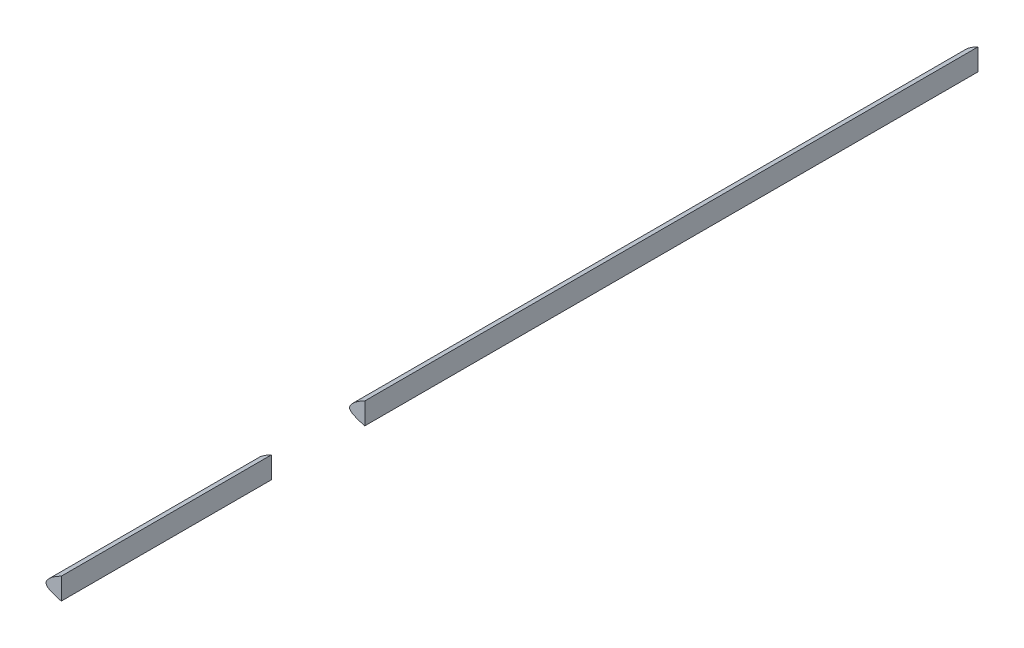
ISO-10303-21;
HEADER;
FILE_DESCRIPTION(('STEP AP214'),'2;1');
FILE_NAME('part.step','',(''),(''),'','','');
FILE_SCHEMA(('AUTOMOTIVE_DESIGN { 1 0 10303 214 1 1 1 1 }'));
ENDSEC;
DATA;
#1=APPLICATION_CONTEXT('core data for automotive mechanical design processes');
#2=APPLICATION_PROTOCOL_DEFINITION('international standard','automotive_design',2000,#1);
#3=PRODUCT_CONTEXT('',#1,'mechanical');
#4=PRODUCT('Part','Part','',(#3));
#5=PRODUCT_RELATED_PRODUCT_CATEGORY('part','',(#4));
#6=PRODUCT_DEFINITION_FORMATION('','',#4);
#7=PRODUCT_DEFINITION_CONTEXT('part definition',#1,'design');
#8=PRODUCT_DEFINITION('design','',#6,#7);
#9=PRODUCT_DEFINITION_SHAPE('','',#8);
#10=(LENGTH_UNIT() NAMED_UNIT(*) SI_UNIT(.MILLI.,.METRE.));
#11=(NAMED_UNIT(*) PLANE_ANGLE_UNIT() SI_UNIT($,.RADIAN.));
#12=(NAMED_UNIT(*) SI_UNIT($,.STERADIAN.) SOLID_ANGLE_UNIT());
#13=UNCERTAINTY_MEASURE_WITH_UNIT(LENGTH_MEASURE(1.E-05),#10,'distance_accuracy_value','');
#14=(GEOMETRIC_REPRESENTATION_CONTEXT(3) GLOBAL_UNCERTAINTY_ASSIGNED_CONTEXT((#13)) GLOBAL_UNIT_ASSIGNED_CONTEXT((#10,
#11,#12)) REPRESENTATION_CONTEXT('',''));
#15=CARTESIAN_POINT('',(0.,0.,0.));
#16=DIRECTION('',(0.,0.,1.));
#17=DIRECTION('',(1.,0.,0.));
#18=AXIS2_PLACEMENT_3D('',#15,#16,#17);
#19=CARTESIAN_POINT('',(1.15165455923713,2.60088125935629,761.999746));
#20=DIRECTION('',(0.,0.,1.));
#21=DIRECTION('',(-1.,0.,0.));
#22=AXIS2_PLACEMENT_3D('',#19,#20,#21);
#23=PLANE('',#22);
#24=DIRECTION('',(0.,-1.,0.));
#25=VECTOR('',#24,1.);
#26=CARTESIAN_POINT('',(12.7000000000001,0.,761.999746));
#27=LINE('',#26,#25);
#28=CARTESIAN_POINT('',(12.7000000000001,11.1170877286177,761.999746));
#29=VERTEX_POINT('',#28);
#30=CARTESIAN_POINT('',(12.7000000000001,-6.87603561469755,761.999746));
#31=VERTEX_POINT('',#30);
#32=EDGE_CURVE('E75',#29,#31,#27,.T.);
#33=ORIENTED_EDGE('',*,*,#32,.F.);
#34=CARTESIAN_POINT('',(324.9026935512,0.,761.999746));
#35=CARTESIAN_POINT('',(324.90346319559,0.0233133583806574,761.999746));
#36=CARTESIAN_POINT('',(322.493960124611,0.266874853266928,761.999746));
#37=CARTESIAN_POINT('',(320.107118726271,0.728898481684864,761.999746));
#38=CARTESIAN_POINT('',(314.479929879271,1.69659954466814,761.999746));
#39=CARTESIAN_POINT('',(307.761979309178,2.96651084650256,761.999746));
#40=CARTESIAN_POINT('',(299.156213965818,4.44402058990994,761.999746));
#41=CARTESIAN_POINT('',(289.108994082194,6.05458721176259,761.999746));
#42=CARTESIAN_POINT('',(277.614504556848,7.85862541822672,761.999746));
#43=CARTESIAN_POINT('',(264.867967681756,9.82863928319501,761.999746));
#44=CARTESIAN_POINT('',(251.037893607433,11.9464568649147,761.999746));
#45=CARTESIAN_POINT('',(236.320520328163,14.1628286822193,761.999746));
#46=CARTESIAN_POINT('',(220.915494029042,16.4347978422618,761.999746));
#47=CARTESIAN_POINT('',(205.033677241231,18.7162921045369,761.999746));
#48=CARTESIAN_POINT('',(188.883341886899,20.9229885970704,761.999746));
#49=CARTESIAN_POINT('',(172.682407247215,22.9973105242966,761.999746));
#50=CARTESIAN_POINT('',(156.622614564687,24.8301784866328,761.999746));
#51=CARTESIAN_POINT('',(140.85040765116,26.2625796247527,761.999746));
#52=CARTESIAN_POINT('',(125.478771127742,27.2050458448488,761.999746));
#53=CARTESIAN_POINT('',(110.596641231566,27.6094132257854,761.999746));
#54=CARTESIAN_POINT('',(96.2853033385808,27.4446531652477,761.999746));
#55=CARTESIAN_POINT('',(82.6164523566715,26.7221772489685,761.999746));
#56=CARTESIAN_POINT('',(69.6684349637199,25.4642524848224,761.999746));
#57=CARTESIAN_POINT('',(57.5288522663284,23.7890753252532,761.999746));
#58=CARTESIAN_POINT('',(46.3056688527853,21.7557737945352,761.999746));
#59=CARTESIAN_POINT('',(36.1124988210342,19.421560606896,761.999746));
#60=CARTESIAN_POINT('',(27.0454876777921,16.8469786053261,761.999746));
#61=CARTESIAN_POINT('',(19.1969550247217,14.0824194665185,761.999746));
#62=CARTESIAN_POINT('',(12.6195182535387,11.1953401492948,761.999746));
#63=CARTESIAN_POINT('',(7.39382924872228,8.27357700541017,761.999746));
#64=CARTESIAN_POINT('',(3.46645559888262,5.36260960395899,761.999746));
#65=CARTESIAN_POINT('',(1.0721441800177,2.69745028336921,761.999746));
#66=CARTESIAN_POINT('',(-0.44301831227786,-0.0163803086251834,761.999746));
#67=CARTESIAN_POINT('',(1.14212328936869,-2.66038157127671,761.999746));
#68=CARTESIAN_POINT('',(4.36503605971503,-4.22676457114381,761.999746));
#69=CARTESIAN_POINT('',(8.97122140423381,-6.02880941856467,761.999746));
#70=CARTESIAN_POINT('',(15.243598773671,-7.49562746974023,761.999746));
#71=CARTESIAN_POINT('',(23.0320560801708,-8.81343307785173,761.999746));
#72=CARTESIAN_POINT('',(32.3248291039904,-9.88501521121111,761.999746));
#73=CARTESIAN_POINT('',(43.02561085123,-10.7220049250572,761.999746));
#74=CARTESIAN_POINT('',(55.0370190293927,-11.3213307402037,761.999746));
#75=CARTESIAN_POINT('',(68.2344021608391,-11.6831205739109,761.999746));
#76=CARTESIAN_POINT('',(82.4768909373014,-11.8216946355356,761.999746));
#77=CARTESIAN_POINT('',(97.6058535702517,-11.7312635564645,761.999746));
#78=CARTESIAN_POINT('',(113.468681032216,-11.4146303668036,761.999746));
#79=CARTESIAN_POINT('',(129.930020512529,-10.7984705199419,761.999746));
#80=CARTESIAN_POINT('',(146.859715046732,-9.93880113727659,761.999746));
#81=CARTESIAN_POINT('',(164.102555427845,-8.95468862894909,761.999746));
#82=CARTESIAN_POINT('',(181.455347717627,-7.91418790276717,761.999746));
#83=CARTESIAN_POINT('',(198.694582838916,-6.86098310953203,761.999746));
#84=CARTESIAN_POINT('',(215.596359860735,-5.83696040869958,761.999746));
#85=CARTESIAN_POINT('',(231.942646986744,-4.86345762457903,761.999746));
#86=CARTESIAN_POINT('',(247.517899408465,-3.96716262112094,761.999746));
#87=CARTESIAN_POINT('',(262.118380872368,-3.15712058268027,761.999746));
#88=CARTESIAN_POINT('',(275.542852028211,-2.44567542809517,761.999746));
#89=CARTESIAN_POINT('',(287.622696903447,-1.83567813821833,761.999746));
#90=CARTESIAN_POINT('',(298.158964312839,-1.30681197821665,761.999746));
#91=CARTESIAN_POINT('',(307.165416690346,-0.826816663963498,761.999746));
#92=CARTESIAN_POINT('',(314.173983408068,-0.368946974828929,761.999746));
#93=CARTESIAN_POINT('',(319.999788969716,-0.117218531002151,761.999746));
#94=CARTESIAN_POINT('',(322.456899939764,0.0391125120748008,761.999746));
#95=CARTESIAN_POINT('',(324.901921434116,-0.0233882589368036,761.999746));
#96=CARTESIAN_POINT('',(324.9026935512,0.,761.999746));
#97=B_SPLINE_CURVE_WITH_KNOTS('',3,(#34,#35,#36,#37,#38,#39,#40,#41,#42,#43,#44,#45,#46,#47,#48,
#49,#50,#51,#52,#53,#54,#55,#56,#57,#58,#59,#60,#61,#62,#63,#64,#65,#66,#67,#68,#69,#70,#71,#72,
#73,#74,#75,#76,#77,#78,#79,#80,#81,#82,#83,#84,#85,#86,#87,#88,#89,#90,#91,#92,#93,#94,#95,
#96),.UNSPECIFIED.,.T.,.F.,(4,1,1,1,1,1,1,1,1,1,1,1,1,1,1,1,1,1,1,1,1,1,1,1,1,1,1,1,1,1,1,1,1,1,
1,1,1,1,1,1,1,1,1,1,1,1,1,1,1,1,1,1,1,1,1,1,1,1,1,1,4),(0.,0.00174808161666409,
0.00682736461152588,0.0148802194660928,0.0255723245187996,0.0386941569613535,0.0541707804092893,
0.0718340915004338,0.0914345327939838,0.112684613523076,0.135293128889252,0.158943981406575,
0.183314993013972,0.208069947428828,0.232879415911381,0.257398767385958,0.28138363259568,
0.304705763006072,0.32724149700788,0.348896563368039,0.369606939586334,0.389308375744097,
0.407885695760754,0.425177148613117,0.441026789913431,0.455299971521906,0.467903884546168,
0.478751648141021,0.487814349118281,0.495090030563699,0.500616983015744,0.504451368015862,
0.507803776366331,0.513091193317012,0.52054622904494,0.530249123140569,0.542213645081559,
0.556382479077403,0.572655501749116,0.590894528635496,0.610925387189739,0.632535858974259,
0.655496365431996,0.679547083246405,0.704498568619219,0.730211424578536,0.756435524546716,
0.782836661122501,0.809062449565475,0.834775916464845,0.859641281327499,0.883337826525987,
0.905540839068826,0.925965138816007,0.944326312756837,0.960365876879218,0.973929437555459,
0.984907697461011,0.993111340436855,0.998246302191831,1.),.UNSPECIFIED.);
#98=EDGE_CURVE('E12',#29,#31,#97,.T.);
#99=ORIENTED_EDGE('',*,*,#98,.T.);
#100=EDGE_LOOP('',(#33,#99));
#101=FACE_BOUND('',#100,.T.);
#102=ADVANCED_FACE('F45',(#101),#23,.T.);
#103=CARTESIAN_POINT('',(12.7000000000001,0.,761.999746));
#104=DIRECTION('',(-1.,0.,0.));
#105=DIRECTION('',(0.,-1.,0.));
#106=AXIS2_PLACEMENT_3D('',#103,#104,#105);
#107=PLANE('',#106);
#108=DIRECTION('',(0.,0.,-1.));
#109=VECTOR('',#108,1.);
#110=CARTESIAN_POINT('',(12.7000000000001,11.1170877286177,761.999746));
#111=LINE('',#110,#109);
#112=CARTESIAN_POINT('',(12.7000000000001,11.1170877286177,587.445357999995));
#113=VERTEX_POINT('',#112);
#114=EDGE_CURVE('E80',#29,#113,#111,.T.);
#115=ORIENTED_EDGE('',*,*,#114,.F.);
#116=ORIENTED_EDGE('',*,*,#32,.T.);
#117=DIRECTION('',(0.,0.,-1.));
#118=VECTOR('',#117,1.);
#119=CARTESIAN_POINT('',(12.7000000000001,-6.87603561469755,761.999746));
#120=LINE('',#119,#118);
#121=CARTESIAN_POINT('',(12.7000000000001,-6.87603561469755,587.445357999995));
#122=VERTEX_POINT('',#121);
#123=EDGE_CURVE('E55',#31,#122,#120,.T.);
#124=ORIENTED_EDGE('',*,*,#123,.T.);
#125=DIRECTION('',(0.,1.,0.));
#126=VECTOR('',#125,1.);
#127=CARTESIAN_POINT('',(12.7000000000001,11.1170877286177,587.445357999995));
#128=LINE('',#127,#126);
#129=EDGE_CURVE('E74',#122,#113,#128,.T.);
#130=ORIENTED_EDGE('',*,*,#129,.T.);
#131=EDGE_LOOP('',(#115,#116,#124,#130));
#132=FACE_BOUND('',#131,.T.);
#133=ADVANCED_FACE('F78',(#132),#107,.F.);
#134=CARTESIAN_POINT('',(324.9026935512,0.,1090.34141295382));
#135=CARTESIAN_POINT('',(324.90346319559,0.0233133583806574,1090.34141295382));
#136=CARTESIAN_POINT('',(322.493960124611,0.266874853266928,1090.34141295382));
#137=CARTESIAN_POINT('',(320.107118726271,0.728898481684864,1090.34141295382));
#138=CARTESIAN_POINT('',(314.479929879271,1.69659954466814,1090.34141295382));
#139=CARTESIAN_POINT('',(307.761979309178,2.96651084650256,1090.34141295382));
#140=CARTESIAN_POINT('',(299.156213965818,4.44402058990994,1090.34141295382));
#141=CARTESIAN_POINT('',(289.108994082194,6.05458721176259,1090.34141295382));
#142=CARTESIAN_POINT('',(277.614504556848,7.85862541822672,1090.34141295382));
#143=CARTESIAN_POINT('',(264.867967681756,9.82863928319501,1090.34141295382));
#144=CARTESIAN_POINT('',(251.037893607433,11.9464568649147,1090.34141295382));
#145=CARTESIAN_POINT('',(236.320520328163,14.1628286822193,1090.34141295382));
#146=CARTESIAN_POINT('',(220.915494029042,16.4347978422618,1090.34141295382));
#147=CARTESIAN_POINT('',(205.033677241231,18.7162921045369,1090.34141295382));
#148=CARTESIAN_POINT('',(188.883341886899,20.9229885970704,1090.34141295382));
#149=CARTESIAN_POINT('',(172.682407247215,22.9973105242966,1090.34141295382));
#150=CARTESIAN_POINT('',(156.622614564687,24.8301784866328,1090.34141295382));
#151=CARTESIAN_POINT('',(140.85040765116,26.2625796247527,1090.34141295382));
#152=CARTESIAN_POINT('',(125.478771127742,27.2050458448488,1090.34141295382));
#153=CARTESIAN_POINT('',(110.596641231566,27.6094132257854,1090.34141295382));
#154=CARTESIAN_POINT('',(96.2853033385808,27.4446531652477,1090.34141295382));
#155=CARTESIAN_POINT('',(82.6164523566715,26.7221772489685,1090.34141295382));
#156=CARTESIAN_POINT('',(69.6684349637199,25.4642524848224,1090.34141295382));
#157=CARTESIAN_POINT('',(57.5288522663284,23.7890753252532,1090.34141295382));
#158=CARTESIAN_POINT('',(46.3056688527853,21.7557737945352,1090.34141295382));
#159=CARTESIAN_POINT('',(36.1124988210342,19.421560606896,1090.34141295382));
#160=CARTESIAN_POINT('',(27.0454876777921,16.8469786053261,1090.34141295382));
#161=CARTESIAN_POINT('',(19.1969550247217,14.0824194665185,1090.34141295382));
#162=CARTESIAN_POINT('',(12.6195182535387,11.1953401492948,1090.34141295382));
#163=CARTESIAN_POINT('',(7.39382924872228,8.27357700541017,1090.34141295382));
#164=CARTESIAN_POINT('',(3.46645559888262,5.36260960395899,1090.34141295382));
#165=CARTESIAN_POINT('',(1.0721441800177,2.69745028336921,1090.34141295382));
#166=CARTESIAN_POINT('',(-0.44301831227786,-0.0163803086251834,1090.34141295382));
#167=CARTESIAN_POINT('',(1.14212328936869,-2.66038157127671,1090.34141295382));
#168=CARTESIAN_POINT('',(4.36503605971503,-4.22676457114381,1090.34141295382));
#169=CARTESIAN_POINT('',(8.97122140423381,-6.02880941856467,1090.34141295382));
#170=CARTESIAN_POINT('',(15.243598773671,-7.49562746974023,1090.34141295382));
#171=CARTESIAN_POINT('',(23.0320560801708,-8.81343307785173,1090.34141295382));
#172=CARTESIAN_POINT('',(32.3248291039904,-9.88501521121111,1090.34141295382));
#173=CARTESIAN_POINT('',(43.02561085123,-10.7220049250572,1090.34141295382));
#174=CARTESIAN_POINT('',(55.0370190293927,-11.3213307402037,1090.34141295382));
#175=CARTESIAN_POINT('',(68.2344021608391,-11.6831205739109,1090.34141295382));
#176=CARTESIAN_POINT('',(82.4768909373014,-11.8216946355356,1090.34141295382));
#177=CARTESIAN_POINT('',(97.6058535702517,-11.7312635564645,1090.34141295382));
#178=CARTESIAN_POINT('',(113.468681032216,-11.4146303668036,1090.34141295382));
#179=CARTESIAN_POINT('',(129.930020512529,-10.7984705199419,1090.34141295382));
#180=CARTESIAN_POINT('',(146.859715046732,-9.93880113727659,1090.34141295382));
#181=CARTESIAN_POINT('',(164.102555427845,-8.95468862894909,1090.34141295382));
#182=CARTESIAN_POINT('',(181.455347717627,-7.91418790276717,1090.34141295382));
#183=CARTESIAN_POINT('',(198.694582838916,-6.86098310953203,1090.34141295382));
#184=CARTESIAN_POINT('',(215.596359860735,-5.83696040869958,1090.34141295382));
#185=CARTESIAN_POINT('',(231.942646986744,-4.86345762457903,1090.34141295382));
#186=CARTESIAN_POINT('',(247.517899408465,-3.96716262112094,1090.34141295382));
#187=CARTESIAN_POINT('',(262.118380872368,-3.15712058268027,1090.34141295382));
#188=CARTESIAN_POINT('',(275.542852028211,-2.44567542809517,1090.34141295382));
#189=CARTESIAN_POINT('',(287.622696903447,-1.83567813821833,1090.34141295382));
#190=CARTESIAN_POINT('',(298.158964312839,-1.30681197821665,1090.34141295382));
#191=CARTESIAN_POINT('',(307.165416690346,-0.826816663963498,1090.34141295382));
#192=CARTESIAN_POINT('',(314.173983408068,-0.368946974828929,1090.34141295382));
#193=CARTESIAN_POINT('',(319.999788969716,-0.117218531002151,1090.34141295382));
#194=CARTESIAN_POINT('',(322.456899939764,0.0391125120748008,1090.34141295382));
#195=CARTESIAN_POINT('',(324.901921434116,-0.0233882589368036,1090.34141295382));
#196=CARTESIAN_POINT('',(324.9026935512,0.,1090.34141295382));
#197=B_SPLINE_CURVE_WITH_KNOTS('',3,(#134,#135,#136,#137,#138,#139,#140,#141,#142,#143,#144,
#145,#146,#147,#148,#149,#150,#151,#152,#153,#154,#155,#156,#157,#158,#159,#160,#161,#162,#163,
#164,#165,#166,#167,#168,#169,#170,#171,#172,#173,#174,#175,#176,#177,#178,#179,#180,#181,#182,
#183,#184,#185,#186,#187,#188,#189,#190,#191,#192,#193,#194,#195,#196),.UNSPECIFIED.,.T.,.F.,(4,
1,1,1,1,1,1,1,1,1,1,1,1,1,1,1,1,1,1,1,1,1,1,1,1,1,1,1,1,1,1,1,1,1,1,1,1,1,1,1,1,1,1,1,1,1,1,1,1,
1,1,1,1,1,1,1,1,1,1,1,4),(0.,0.00174808161666409,0.00682736461152588,0.0148802194660928,
0.0255723245187996,0.0386941569613535,0.0541707804092893,0.0718340915004338,0.0914345327939838,
0.112684613523076,0.135293128889252,0.158943981406575,0.183314993013972,0.208069947428828,
0.232879415911381,0.257398767385958,0.28138363259568,0.304705763006072,0.32724149700788,
0.348896563368039,0.369606939586334,0.389308375744097,0.407885695760754,0.425177148613117,
0.441026789913431,0.455299971521906,0.467903884546168,0.478751648141021,0.487814349118281,
0.495090030563699,0.500616983015744,0.504451368015862,0.507803776366331,0.513091193317012,
0.52054622904494,0.530249123140569,0.542213645081559,0.556382479077403,0.572655501749116,
0.590894528635496,0.610925387189739,0.632535858974259,0.655496365431996,0.679547083246405,
0.704498568619219,0.730211424578536,0.756435524546716,0.782836661122501,0.809062449565475,
0.834775916464845,0.859641281327499,0.883337826525987,0.905540839068826,0.925965138816007,
0.944326312756837,0.960365876879218,0.973929437555459,0.984907697461011,0.993111340436855,
0.998246302191831,1.),.UNSPECIFIED.);
#198=DIRECTION('',(0.,0.,-1.));
#199=VECTOR('',#198,1.);
#200=SURFACE_OF_LINEAR_EXTRUSION('',#197,#199);
#201=CARTESIAN_POINT('',(324.9026935512,0.,587.445357999996));
#202=CARTESIAN_POINT('',(324.90346319559,0.0233133583806574,587.445357999996));
#203=CARTESIAN_POINT('',(322.493960124611,0.266874853266928,587.445357999996));
#204=CARTESIAN_POINT('',(320.107118726271,0.728898481684864,587.445357999996));
#205=CARTESIAN_POINT('',(314.479929879271,1.69659954466814,587.445357999996));
#206=CARTESIAN_POINT('',(307.761979309178,2.96651084650256,587.445357999996));
#207=CARTESIAN_POINT('',(299.156213965818,4.44402058990994,587.445357999996));
#208=CARTESIAN_POINT('',(289.108994082194,6.05458721176259,587.445357999996));
#209=CARTESIAN_POINT('',(277.614504556848,7.85862541822672,587.445357999996));
#210=CARTESIAN_POINT('',(264.867967681756,9.82863928319501,587.445357999996));
#211=CARTESIAN_POINT('',(251.037893607433,11.9464568649147,587.445357999996));
#212=CARTESIAN_POINT('',(236.320520328163,14.1628286822193,587.445357999996));
#213=CARTESIAN_POINT('',(220.915494029042,16.4347978422618,587.445357999996));
#214=CARTESIAN_POINT('',(205.033677241231,18.7162921045369,587.445357999996));
#215=CARTESIAN_POINT('',(188.883341886899,20.9229885970704,587.445357999996));
#216=CARTESIAN_POINT('',(172.682407247215,22.9973105242966,587.445357999996));
#217=CARTESIAN_POINT('',(156.622614564687,24.8301784866328,587.445357999996));
#218=CARTESIAN_POINT('',(140.85040765116,26.2625796247527,587.445357999996));
#219=CARTESIAN_POINT('',(125.478771127742,27.2050458448488,587.445357999996));
#220=CARTESIAN_POINT('',(110.596641231566,27.6094132257854,587.445357999996));
#221=CARTESIAN_POINT('',(96.2853033385808,27.4446531652477,587.445357999996));
#222=CARTESIAN_POINT('',(82.6164523566715,26.7221772489685,587.445357999996));
#223=CARTESIAN_POINT('',(69.6684349637199,25.4642524848224,587.445357999996));
#224=CARTESIAN_POINT('',(57.5288522663284,23.7890753252532,587.445357999996));
#225=CARTESIAN_POINT('',(46.3056688527853,21.7557737945352,587.445357999996));
#226=CARTESIAN_POINT('',(36.1124988210342,19.421560606896,587.445357999996));
#227=CARTESIAN_POINT('',(27.0454876777921,16.8469786053261,587.445357999996));
#228=CARTESIAN_POINT('',(19.1969550247217,14.0824194665185,587.445357999996));
#229=CARTESIAN_POINT('',(12.6195182535387,11.1953401492948,587.445357999996));
#230=CARTESIAN_POINT('',(7.39382924872228,8.27357700541017,587.445357999996));
#231=CARTESIAN_POINT('',(3.46645559888262,5.36260960395899,587.445357999996));
#232=CARTESIAN_POINT('',(1.0721441800177,2.69745028336921,587.445357999996));
#233=CARTESIAN_POINT('',(-0.44301831227786,-0.0163803086251834,587.445357999996));
#234=CARTESIAN_POINT('',(1.14212328936869,-2.66038157127671,587.445357999996));
#235=CARTESIAN_POINT('',(4.36503605971503,-4.22676457114381,587.445357999996));
#236=CARTESIAN_POINT('',(8.97122140423381,-6.02880941856467,587.445357999996));
#237=CARTESIAN_POINT('',(15.243598773671,-7.49562746974023,587.445357999996));
#238=CARTESIAN_POINT('',(23.0320560801708,-8.81343307785173,587.445357999996));
#239=CARTESIAN_POINT('',(32.3248291039904,-9.88501521121111,587.445357999996));
#240=CARTESIAN_POINT('',(43.02561085123,-10.7220049250572,587.445357999996));
#241=CARTESIAN_POINT('',(55.0370190293927,-11.3213307402037,587.445357999996));
#242=CARTESIAN_POINT('',(68.2344021608391,-11.6831205739109,587.445357999996));
#243=CARTESIAN_POINT('',(82.4768909373014,-11.8216946355356,587.445357999996));
#244=CARTESIAN_POINT('',(97.6058535702517,-11.7312635564645,587.445357999996));
#245=CARTESIAN_POINT('',(113.468681032216,-11.4146303668036,587.445357999996));
#246=CARTESIAN_POINT('',(129.930020512529,-10.7984705199419,587.445357999996));
#247=CARTESIAN_POINT('',(146.859715046732,-9.93880113727659,587.445357999996));
#248=CARTESIAN_POINT('',(164.102555427845,-8.95468862894909,587.445357999996));
#249=CARTESIAN_POINT('',(181.455347717627,-7.91418790276717,587.445357999996));
#250=CARTESIAN_POINT('',(198.694582838916,-6.86098310953203,587.445357999996));
#251=CARTESIAN_POINT('',(215.596359860735,-5.83696040869958,587.445357999996));
#252=CARTESIAN_POINT('',(231.942646986744,-4.86345762457903,587.445357999996));
#253=CARTESIAN_POINT('',(247.517899408465,-3.96716262112094,587.445357999996));
#254=CARTESIAN_POINT('',(262.118380872368,-3.15712058268027,587.445357999996));
#255=CARTESIAN_POINT('',(275.542852028211,-2.44567542809517,587.445357999996));
#256=CARTESIAN_POINT('',(287.622696903447,-1.83567813821833,587.445357999996));
#257=CARTESIAN_POINT('',(298.158964312839,-1.30681197821665,587.445357999996));
#258=CARTESIAN_POINT('',(307.165416690346,-0.826816663963498,587.445357999996));
#259=CARTESIAN_POINT('',(314.173983408068,-0.368946974828929,587.445357999996));
#260=CARTESIAN_POINT('',(319.999788969716,-0.117218531002151,587.445357999996));
#261=CARTESIAN_POINT('',(322.456899939764,0.0391125120748008,587.445357999996));
#262=CARTESIAN_POINT('',(324.901921434116,-0.0233882589368036,587.445357999996));
#263=CARTESIAN_POINT('',(324.9026935512,0.,587.445357999996));
#264=B_SPLINE_CURVE_WITH_KNOTS('',3,(#201,#202,#203,#204,#205,#206,#207,#208,#209,#210,#211,
#212,#213,#214,#215,#216,#217,#218,#219,#220,#221,#222,#223,#224,#225,#226,#227,#228,#229,#230,
#231,#232,#233,#234,#235,#236,#237,#238,#239,#240,#241,#242,#243,#244,#245,#246,#247,#248,#249,
#250,#251,#252,#253,#254,#255,#256,#257,#258,#259,#260,#261,#262,#263),.UNSPECIFIED.,.T.,.F.,(4,
1,1,1,1,1,1,1,1,1,1,1,1,1,1,1,1,1,1,1,1,1,1,1,1,1,1,1,1,1,1,1,1,1,1,1,1,1,1,1,1,1,1,1,1,1,1,1,1,
1,1,1,1,1,1,1,1,1,1,1,4),(0.,0.00174808161666409,0.00682736461152588,0.0148802194660928,
0.0255723245187996,0.0386941569613535,0.0541707804092893,0.0718340915004338,0.0914345327939838,
0.112684613523076,0.135293128889252,0.158943981406575,0.183314993013972,0.208069947428828,
0.232879415911381,0.257398767385958,0.28138363259568,0.304705763006072,0.32724149700788,
0.348896563368039,0.369606939586334,0.389308375744097,0.407885695760754,0.425177148613117,
0.441026789913431,0.455299971521906,0.467903884546168,0.478751648141021,0.487814349118281,
0.495090030563699,0.500616983015744,0.504451368015862,0.507803776366331,0.513091193317012,
0.52054622904494,0.530249123140569,0.542213645081559,0.556382479077403,0.572655501749116,
0.590894528635496,0.610925387189739,0.632535858974259,0.655496365431996,0.679547083246405,
0.704498568619219,0.730211424578536,0.756435524546716,0.782836661122501,0.809062449565475,
0.834775916464845,0.859641281327499,0.883337826525987,0.905540839068826,0.925965138816007,
0.944326312756837,0.960365876879218,0.973929437555459,0.984907697461011,0.993111340436855,
0.998246302191831,1.),.UNSPECIFIED.);
#265=EDGE_CURVE('E62',#113,#122,#264,.T.);
#266=ORIENTED_EDGE('',*,*,#265,.T.);
#267=ORIENTED_EDGE('',*,*,#123,.F.);
#268=ORIENTED_EDGE('',*,*,#98,.F.);
#269=ORIENTED_EDGE('',*,*,#114,.T.);
#270=EDGE_LOOP('',(#266,#267,#268,#269));
#271=FACE_BOUND('',#270,.T.);
#272=ADVANCED_FACE('F82',(#271),#200,.F.);
#273=CARTESIAN_POINT('',(92.5069931739156,11.1170877286177,587.445357999995));
#274=DIRECTION('',(0.,0.,1.));
#275=DIRECTION('',(-1.,0.,0.));
#276=AXIS2_PLACEMENT_3D('',#273,#274,#275);
#277=PLANE('',#276);
#278=ORIENTED_EDGE('',*,*,#265,.F.);
#279=ORIENTED_EDGE('',*,*,#129,.F.);
#280=EDGE_LOOP('',(#278,#279));
#281=FACE_BOUND('',#280,.T.);
#282=ADVANCED_FACE('F73',(#281),#277,.F.);
#283=CLOSED_SHELL('',(#102,#133,#272,#282));
#284=MANIFOLD_SOLID_BREP('B2',#283);
#285=CARTESIAN_POINT('',(324.9026935512,0.,1090.34141295382));
#286=CARTESIAN_POINT('',(324.90346319559,0.0233133583806574,1090.34141295382));
#287=CARTESIAN_POINT('',(322.493960124611,0.266874853266928,1090.34141295382));
#288=CARTESIAN_POINT('',(320.107118726271,0.728898481684864,1090.34141295382));
#289=CARTESIAN_POINT('',(314.479929879271,1.69659954466814,1090.34141295382));
#290=CARTESIAN_POINT('',(307.761979309178,2.96651084650256,1090.34141295382));
#291=CARTESIAN_POINT('',(299.156213965818,4.44402058990994,1090.34141295382));
#292=CARTESIAN_POINT('',(289.108994082194,6.05458721176259,1090.34141295382));
#293=CARTESIAN_POINT('',(277.614504556848,7.85862541822672,1090.34141295382));
#294=CARTESIAN_POINT('',(264.867967681756,9.82863928319501,1090.34141295382));
#295=CARTESIAN_POINT('',(251.037893607433,11.9464568649147,1090.34141295382));
#296=CARTESIAN_POINT('',(236.320520328163,14.1628286822193,1090.34141295382));
#297=CARTESIAN_POINT('',(220.915494029042,16.4347978422618,1090.34141295382));
#298=CARTESIAN_POINT('',(205.033677241231,18.7162921045369,1090.34141295382));
#299=CARTESIAN_POINT('',(188.883341886899,20.9229885970704,1090.34141295382));
#300=CARTESIAN_POINT('',(172.682407247215,22.9973105242966,1090.34141295382));
#301=CARTESIAN_POINT('',(156.622614564687,24.8301784866328,1090.34141295382));
#302=CARTESIAN_POINT('',(140.85040765116,26.2625796247527,1090.34141295382));
#303=CARTESIAN_POINT('',(125.478771127742,27.2050458448488,1090.34141295382));
#304=CARTESIAN_POINT('',(110.596641231566,27.6094132257854,1090.34141295382));
#305=CARTESIAN_POINT('',(96.2853033385808,27.4446531652477,1090.34141295382));
#306=CARTESIAN_POINT('',(82.6164523566715,26.7221772489685,1090.34141295382));
#307=CARTESIAN_POINT('',(69.6684349637199,25.4642524848224,1090.34141295382));
#308=CARTESIAN_POINT('',(57.5288522663284,23.7890753252532,1090.34141295382));
#309=CARTESIAN_POINT('',(46.3056688527853,21.7557737945352,1090.34141295382));
#310=CARTESIAN_POINT('',(36.1124988210342,19.421560606896,1090.34141295382));
#311=CARTESIAN_POINT('',(27.0454876777921,16.8469786053261,1090.34141295382));
#312=CARTESIAN_POINT('',(19.1969550247217,14.0824194665185,1090.34141295382));
#313=CARTESIAN_POINT('',(12.6195182535387,11.1953401492948,1090.34141295382));
#314=CARTESIAN_POINT('',(7.39382924872228,8.27357700541017,1090.34141295382));
#315=CARTESIAN_POINT('',(3.46645559888262,5.36260960395899,1090.34141295382));
#316=CARTESIAN_POINT('',(1.0721441800177,2.69745028336921,1090.34141295382));
#317=CARTESIAN_POINT('',(-0.44301831227786,-0.0163803086251834,1090.34141295382));
#318=CARTESIAN_POINT('',(1.14212328936869,-2.66038157127671,1090.34141295382));
#319=CARTESIAN_POINT('',(4.36503605971503,-4.22676457114381,1090.34141295382));
#320=CARTESIAN_POINT('',(8.97122140423381,-6.02880941856467,1090.34141295382));
#321=CARTESIAN_POINT('',(15.243598773671,-7.49562746974023,1090.34141295382));
#322=CARTESIAN_POINT('',(23.0320560801708,-8.81343307785173,1090.34141295382));
#323=CARTESIAN_POINT('',(32.3248291039904,-9.88501521121111,1090.34141295382));
#324=CARTESIAN_POINT('',(43.02561085123,-10.7220049250572,1090.34141295382));
#325=CARTESIAN_POINT('',(55.0370190293927,-11.3213307402037,1090.34141295382));
#326=CARTESIAN_POINT('',(68.2344021608391,-11.6831205739109,1090.34141295382));
#327=CARTESIAN_POINT('',(82.4768909373014,-11.8216946355356,1090.34141295382));
#328=CARTESIAN_POINT('',(97.6058535702517,-11.7312635564645,1090.34141295382));
#329=CARTESIAN_POINT('',(113.468681032216,-11.4146303668036,1090.34141295382));
#330=CARTESIAN_POINT('',(129.930020512529,-10.7984705199419,1090.34141295382));
#331=CARTESIAN_POINT('',(146.859715046732,-9.93880113727659,1090.34141295382));
#332=CARTESIAN_POINT('',(164.102555427845,-8.95468862894909,1090.34141295382));
#333=CARTESIAN_POINT('',(181.455347717627,-7.91418790276717,1090.34141295382));
#334=CARTESIAN_POINT('',(198.694582838916,-6.86098310953203,1090.34141295382));
#335=CARTESIAN_POINT('',(215.596359860735,-5.83696040869958,1090.34141295382));
#336=CARTESIAN_POINT('',(231.942646986744,-4.86345762457903,1090.34141295382));
#337=CARTESIAN_POINT('',(247.517899408465,-3.96716262112094,1090.34141295382));
#338=CARTESIAN_POINT('',(262.118380872368,-3.15712058268027,1090.34141295382));
#339=CARTESIAN_POINT('',(275.542852028211,-2.44567542809517,1090.34141295382));
#340=CARTESIAN_POINT('',(287.622696903447,-1.83567813821833,1090.34141295382));
#341=CARTESIAN_POINT('',(298.158964312839,-1.30681197821665,1090.34141295382));
#342=CARTESIAN_POINT('',(307.165416690346,-0.826816663963498,1090.34141295382));
#343=CARTESIAN_POINT('',(314.173983408068,-0.368946974828929,1090.34141295382));
#344=CARTESIAN_POINT('',(319.999788969716,-0.117218531002151,1090.34141295382));
#345=CARTESIAN_POINT('',(322.456899939764,0.0391125120748008,1090.34141295382));
#346=CARTESIAN_POINT('',(324.901921434116,-0.0233882589368036,1090.34141295382));
#347=CARTESIAN_POINT('',(324.9026935512,0.,1090.34141295382));
#348=B_SPLINE_CURVE_WITH_KNOTS('',3,(#285,#286,#287,#288,#289,#290,#291,#292,#293,#294,#295,
#296,#297,#298,#299,#300,#301,#302,#303,#304,#305,#306,#307,#308,#309,#310,#311,#312,#313,#314,
#315,#316,#317,#318,#319,#320,#321,#322,#323,#324,#325,#326,#327,#328,#329,#330,#331,#332,#333,
#334,#335,#336,#337,#338,#339,#340,#341,#342,#343,#344,#345,#346,#347),.UNSPECIFIED.,.T.,.F.,(4,
1,1,1,1,1,1,1,1,1,1,1,1,1,1,1,1,1,1,1,1,1,1,1,1,1,1,1,1,1,1,1,1,1,1,1,1,1,1,1,1,1,1,1,1,1,1,1,1,
1,1,1,1,1,1,1,1,1,1,1,4),(0.,0.00174808161666409,0.00682736461152588,0.0148802194660928,
0.0255723245187996,0.0386941569613535,0.0541707804092893,0.0718340915004338,0.0914345327939838,
0.112684613523076,0.135293128889252,0.158943981406575,0.183314993013972,0.208069947428828,
0.232879415911381,0.257398767385958,0.28138363259568,0.304705763006072,0.32724149700788,
0.348896563368039,0.369606939586334,0.389308375744097,0.407885695760754,0.425177148613117,
0.441026789913431,0.455299971521906,0.467903884546168,0.478751648141021,0.487814349118281,
0.495090030563699,0.500616983015744,0.504451368015862,0.507803776366331,0.513091193317012,
0.52054622904494,0.530249123140569,0.542213645081559,0.556382479077403,0.572655501749116,
0.590894528635496,0.610925387189739,0.632535858974259,0.655496365431996,0.679547083246405,
0.704498568619219,0.730211424578536,0.756435524546716,0.782836661122501,0.809062449565475,
0.834775916464845,0.859641281327499,0.883337826525987,0.905540839068826,0.925965138816007,
0.944326312756837,0.960365876879218,0.973929437555459,0.984907697461011,0.993111340436855,
0.998246302191831,1.),.UNSPECIFIED.);
#349=DIRECTION('',(0.,0.,-1.));
#350=VECTOR('',#349,1.);
#351=SURFACE_OF_LINEAR_EXTRUSION('',#348,#350);
#352=DIRECTION('',(0.,0.,-1.));
#353=VECTOR('',#352,1.);
#354=CARTESIAN_POINT('',(12.7000000000001,11.1170877286177,761.999746));
#355=LINE('',#354,#353);
#356=CARTESIAN_POINT('',(12.7000000000001,11.1170877286177,509.693163999995));
#357=VERTEX_POINT('',#356);
#358=CARTESIAN_POINT('',(12.7000000000001,11.1170877286177,0.));
#359=VERTEX_POINT('',#358);
#360=EDGE_CURVE('E168',#357,#359,#355,.T.);
#361=ORIENTED_EDGE('',*,*,#360,.T.);
#362=CARTESIAN_POINT('',(324.9026935512,0.,0.));
#363=CARTESIAN_POINT('',(324.90346319559,0.0233133583806574,0.));
#364=CARTESIAN_POINT('',(322.493960124611,0.266874853266928,0.));
#365=CARTESIAN_POINT('',(320.107118726271,0.728898481684864,0.));
#366=CARTESIAN_POINT('',(314.479929879271,1.69659954466814,0.));
#367=CARTESIAN_POINT('',(307.761979309178,2.96651084650256,0.));
#368=CARTESIAN_POINT('',(299.156213965818,4.44402058990994,0.));
#369=CARTESIAN_POINT('',(289.108994082194,6.05458721176259,0.));
#370=CARTESIAN_POINT('',(277.614504556848,7.85862541822672,0.));
#371=CARTESIAN_POINT('',(264.867967681756,9.82863928319501,0.));
#372=CARTESIAN_POINT('',(251.037893607433,11.9464568649147,0.));
#373=CARTESIAN_POINT('',(236.320520328163,14.1628286822193,0.));
#374=CARTESIAN_POINT('',(220.915494029042,16.4347978422618,0.));
#375=CARTESIAN_POINT('',(205.033677241231,18.7162921045369,0.));
#376=CARTESIAN_POINT('',(188.883341886899,20.9229885970704,0.));
#377=CARTESIAN_POINT('',(172.682407247215,22.9973105242966,0.));
#378=CARTESIAN_POINT('',(156.622614564687,24.8301784866328,0.));
#379=CARTESIAN_POINT('',(140.85040765116,26.2625796247527,0.));
#380=CARTESIAN_POINT('',(125.478771127742,27.2050458448488,0.));
#381=CARTESIAN_POINT('',(110.596641231566,27.6094132257854,0.));
#382=CARTESIAN_POINT('',(96.2853033385808,27.4446531652477,0.));
#383=CARTESIAN_POINT('',(82.6164523566715,26.7221772489685,0.));
#384=CARTESIAN_POINT('',(69.6684349637199,25.4642524848224,0.));
#385=CARTESIAN_POINT('',(57.5288522663284,23.7890753252532,0.));
#386=CARTESIAN_POINT('',(46.3056688527853,21.7557737945352,0.));
#387=CARTESIAN_POINT('',(36.1124988210342,19.421560606896,0.));
#388=CARTESIAN_POINT('',(27.0454876777921,16.8469786053261,0.));
#389=CARTESIAN_POINT('',(19.1969550247217,14.0824194665185,0.));
#390=CARTESIAN_POINT('',(12.6195182535387,11.1953401492948,0.));
#391=CARTESIAN_POINT('',(7.39382924872228,8.27357700541017,0.));
#392=CARTESIAN_POINT('',(3.46645559888262,5.36260960395899,0.));
#393=CARTESIAN_POINT('',(1.0721441800177,2.69745028336921,0.));
#394=CARTESIAN_POINT('',(-0.44301831227786,-0.0163803086251834,0.));
#395=CARTESIAN_POINT('',(1.14212328936869,-2.66038157127671,0.));
#396=CARTESIAN_POINT('',(4.36503605971503,-4.22676457114381,0.));
#397=CARTESIAN_POINT('',(8.97122140423381,-6.02880941856467,0.));
#398=CARTESIAN_POINT('',(15.243598773671,-7.49562746974023,0.));
#399=CARTESIAN_POINT('',(23.0320560801708,-8.81343307785173,0.));
#400=CARTESIAN_POINT('',(32.3248291039904,-9.88501521121111,0.));
#401=CARTESIAN_POINT('',(43.02561085123,-10.7220049250572,0.));
#402=CARTESIAN_POINT('',(55.0370190293927,-11.3213307402037,0.));
#403=CARTESIAN_POINT('',(68.2344021608391,-11.6831205739109,0.));
#404=CARTESIAN_POINT('',(82.4768909373014,-11.8216946355356,0.));
#405=CARTESIAN_POINT('',(97.6058535702517,-11.7312635564645,0.));
#406=CARTESIAN_POINT('',(113.468681032216,-11.4146303668036,0.));
#407=CARTESIAN_POINT('',(129.930020512529,-10.7984705199419,0.));
#408=CARTESIAN_POINT('',(146.859715046732,-9.93880113727659,0.));
#409=CARTESIAN_POINT('',(164.102555427845,-8.95468862894909,0.));
#410=CARTESIAN_POINT('',(181.455347717627,-7.91418790276717,0.));
#411=CARTESIAN_POINT('',(198.694582838916,-6.86098310953203,0.));
#412=CARTESIAN_POINT('',(215.596359860735,-5.83696040869958,0.));
#413=CARTESIAN_POINT('',(231.942646986744,-4.86345762457903,0.));
#414=CARTESIAN_POINT('',(247.517899408465,-3.96716262112094,0.));
#415=CARTESIAN_POINT('',(262.118380872368,-3.15712058268027,0.));
#416=CARTESIAN_POINT('',(275.542852028211,-2.44567542809517,0.));
#417=CARTESIAN_POINT('',(287.622696903447,-1.83567813821833,0.));
#418=CARTESIAN_POINT('',(298.158964312839,-1.30681197821665,0.));
#419=CARTESIAN_POINT('',(307.165416690346,-0.826816663963498,0.));
#420=CARTESIAN_POINT('',(314.173983408068,-0.368946974828929,0.));
#421=CARTESIAN_POINT('',(319.999788969716,-0.117218531002151,0.));
#422=CARTESIAN_POINT('',(322.456899939764,0.0391125120748008,0.));
#423=CARTESIAN_POINT('',(324.901921434116,-0.0233882589368036,0.));
#424=CARTESIAN_POINT('',(324.9026935512,0.,0.));
#425=B_SPLINE_CURVE_WITH_KNOTS('',3,(#362,#363,#364,#365,#366,#367,#368,#369,#370,#371,#372,
#373,#374,#375,#376,#377,#378,#379,#380,#381,#382,#383,#384,#385,#386,#387,#388,#389,#390,#391,
#392,#393,#394,#395,#396,#397,#398,#399,#400,#401,#402,#403,#404,#405,#406,#407,#408,#409,#410,
#411,#412,#413,#414,#415,#416,#417,#418,#419,#420,#421,#422,#423,#424),.UNSPECIFIED.,.T.,.F.,(4,
1,1,1,1,1,1,1,1,1,1,1,1,1,1,1,1,1,1,1,1,1,1,1,1,1,1,1,1,1,1,1,1,1,1,1,1,1,1,1,1,1,1,1,1,1,1,1,1,
1,1,1,1,1,1,1,1,1,1,1,4),(0.,0.00174808161666409,0.00682736461152588,0.0148802194660928,
0.0255723245187996,0.0386941569613535,0.0541707804092893,0.0718340915004338,0.0914345327939838,
0.112684613523076,0.135293128889252,0.158943981406575,0.183314993013972,0.208069947428828,
0.232879415911381,0.257398767385958,0.28138363259568,0.304705763006072,0.32724149700788,
0.348896563368039,0.369606939586334,0.389308375744097,0.407885695760754,0.425177148613117,
0.441026789913431,0.455299971521906,0.467903884546168,0.478751648141021,0.487814349118281,
0.495090030563699,0.500616983015744,0.504451368015862,0.507803776366331,0.513091193317012,
0.52054622904494,0.530249123140569,0.542213645081559,0.556382479077403,0.572655501749116,
0.590894528635496,0.610925387189739,0.632535858974259,0.655496365431996,0.679547083246405,
0.704498568619219,0.730211424578536,0.756435524546716,0.782836661122501,0.809062449565475,
0.834775916464845,0.859641281327499,0.883337826525987,0.905540839068826,0.925965138816007,
0.944326312756837,0.960365876879218,0.973929437555459,0.984907697461011,0.993111340436855,
0.998246302191831,1.),.UNSPECIFIED.);
#426=CARTESIAN_POINT('',(12.7000000000001,-6.87603561469755,0.));
#427=VERTEX_POINT('',#426);
#428=EDGE_CURVE('E43',#359,#427,#425,.T.);
#429=ORIENTED_EDGE('',*,*,#428,.T.);
#430=DIRECTION('',(0.,0.,-1.));
#431=VECTOR('',#430,1.);
#432=CARTESIAN_POINT('',(12.7000000000001,-6.87603561469755,761.999746));
#433=LINE('',#432,#431);
#434=CARTESIAN_POINT('',(12.7000000000001,-6.87603561469755,509.693163999995));
#435=VERTEX_POINT('',#434);
#436=EDGE_CURVE('E170',#435,#427,#433,.T.);
#437=ORIENTED_EDGE('',*,*,#436,.F.);
#438=CARTESIAN_POINT('',(324.9026935512,0.,509.693163999996));
#439=CARTESIAN_POINT('',(324.90346319559,0.0233133583806574,509.693163999996));
#440=CARTESIAN_POINT('',(322.493960124611,0.266874853266928,509.693163999996));
#441=CARTESIAN_POINT('',(320.107118726271,0.728898481684864,509.693163999996));
#442=CARTESIAN_POINT('',(314.479929879271,1.69659954466814,509.693163999996));
#443=CARTESIAN_POINT('',(307.761979309178,2.96651084650256,509.693163999996));
#444=CARTESIAN_POINT('',(299.156213965818,4.44402058990994,509.693163999996));
#445=CARTESIAN_POINT('',(289.108994082194,6.05458721176259,509.693163999996));
#446=CARTESIAN_POINT('',(277.614504556848,7.85862541822672,509.693163999996));
#447=CARTESIAN_POINT('',(264.867967681756,9.82863928319501,509.693163999996));
#448=CARTESIAN_POINT('',(251.037893607433,11.9464568649147,509.693163999996));
#449=CARTESIAN_POINT('',(236.320520328163,14.1628286822193,509.693163999996));
#450=CARTESIAN_POINT('',(220.915494029042,16.4347978422618,509.693163999996));
#451=CARTESIAN_POINT('',(205.033677241231,18.7162921045369,509.693163999996));
#452=CARTESIAN_POINT('',(188.883341886899,20.9229885970704,509.693163999996));
#453=CARTESIAN_POINT('',(172.682407247215,22.9973105242966,509.693163999996));
#454=CARTESIAN_POINT('',(156.622614564687,24.8301784866328,509.693163999996));
#455=CARTESIAN_POINT('',(140.85040765116,26.2625796247527,509.693163999996));
#456=CARTESIAN_POINT('',(125.478771127742,27.2050458448488,509.693163999996));
#457=CARTESIAN_POINT('',(110.596641231566,27.6094132257854,509.693163999996));
#458=CARTESIAN_POINT('',(96.2853033385808,27.4446531652477,509.693163999996));
#459=CARTESIAN_POINT('',(82.6164523566715,26.7221772489685,509.693163999996));
#460=CARTESIAN_POINT('',(69.6684349637199,25.4642524848224,509.693163999996));
#461=CARTESIAN_POINT('',(57.5288522663284,23.7890753252532,509.693163999996));
#462=CARTESIAN_POINT('',(46.3056688527853,21.7557737945352,509.693163999996));
#463=CARTESIAN_POINT('',(36.1124988210342,19.421560606896,509.693163999996));
#464=CARTESIAN_POINT('',(27.0454876777921,16.8469786053261,509.693163999996));
#465=CARTESIAN_POINT('',(19.1969550247217,14.0824194665185,509.693163999996));
#466=CARTESIAN_POINT('',(12.6195182535387,11.1953401492948,509.693163999996));
#467=CARTESIAN_POINT('',(7.39382924872228,8.27357700541017,509.693163999996));
#468=CARTESIAN_POINT('',(3.46645559888262,5.36260960395899,509.693163999996));
#469=CARTESIAN_POINT('',(1.0721441800177,2.69745028336921,509.693163999996));
#470=CARTESIAN_POINT('',(-0.44301831227786,-0.0163803086251834,509.693163999996));
#471=CARTESIAN_POINT('',(1.14212328936869,-2.66038157127671,509.693163999996));
#472=CARTESIAN_POINT('',(4.36503605971503,-4.22676457114381,509.693163999996));
#473=CARTESIAN_POINT('',(8.97122140423381,-6.02880941856467,509.693163999996));
#474=CARTESIAN_POINT('',(15.243598773671,-7.49562746974023,509.693163999996));
#475=CARTESIAN_POINT('',(23.0320560801708,-8.81343307785173,509.693163999996));
#476=CARTESIAN_POINT('',(32.3248291039904,-9.88501521121111,509.693163999996));
#477=CARTESIAN_POINT('',(43.02561085123,-10.7220049250572,509.693163999996));
#478=CARTESIAN_POINT('',(55.0370190293927,-11.3213307402037,509.693163999996));
#479=CARTESIAN_POINT('',(68.2344021608391,-11.6831205739109,509.693163999996));
#480=CARTESIAN_POINT('',(82.4768909373014,-11.8216946355356,509.693163999996));
#481=CARTESIAN_POINT('',(97.6058535702517,-11.7312635564645,509.693163999996));
#482=CARTESIAN_POINT('',(113.468681032216,-11.4146303668036,509.693163999996));
#483=CARTESIAN_POINT('',(129.930020512529,-10.7984705199419,509.693163999996));
#484=CARTESIAN_POINT('',(146.859715046732,-9.93880113727659,509.693163999996));
#485=CARTESIAN_POINT('',(164.102555427845,-8.95468862894909,509.693163999996));
#486=CARTESIAN_POINT('',(181.455347717627,-7.91418790276717,509.693163999996));
#487=CARTESIAN_POINT('',(198.694582838916,-6.86098310953203,509.693163999996));
#488=CARTESIAN_POINT('',(215.596359860735,-5.83696040869958,509.693163999996));
#489=CARTESIAN_POINT('',(231.942646986744,-4.86345762457903,509.693163999996));
#490=CARTESIAN_POINT('',(247.517899408465,-3.96716262112094,509.693163999996));
#491=CARTESIAN_POINT('',(262.118380872368,-3.15712058268027,509.693163999996));
#492=CARTESIAN_POINT('',(275.542852028211,-2.44567542809517,509.693163999996));
#493=CARTESIAN_POINT('',(287.622696903447,-1.83567813821833,509.693163999996));
#494=CARTESIAN_POINT('',(298.158964312839,-1.30681197821665,509.693163999996));
#495=CARTESIAN_POINT('',(307.165416690346,-0.826816663963498,509.693163999996));
#496=CARTESIAN_POINT('',(314.173983408068,-0.368946974828929,509.693163999996));
#497=CARTESIAN_POINT('',(319.999788969716,-0.117218531002151,509.693163999996));
#498=CARTESIAN_POINT('',(322.456899939764,0.0391125120748008,509.693163999996));
#499=CARTESIAN_POINT('',(324.901921434116,-0.0233882589368036,509.693163999996));
#500=CARTESIAN_POINT('',(324.9026935512,0.,509.693163999996));
#501=B_SPLINE_CURVE_WITH_KNOTS('',3,(#438,#439,#440,#441,#442,#443,#444,#445,#446,#447,#448,
#449,#450,#451,#452,#453,#454,#455,#456,#457,#458,#459,#460,#461,#462,#463,#464,#465,#466,#467,
#468,#469,#470,#471,#472,#473,#474,#475,#476,#477,#478,#479,#480,#481,#482,#483,#484,#485,#486,
#487,#488,#489,#490,#491,#492,#493,#494,#495,#496,#497,#498,#499,#500),.UNSPECIFIED.,.T.,.F.,(4,
1,1,1,1,1,1,1,1,1,1,1,1,1,1,1,1,1,1,1,1,1,1,1,1,1,1,1,1,1,1,1,1,1,1,1,1,1,1,1,1,1,1,1,1,1,1,1,1,
1,1,1,1,1,1,1,1,1,1,1,4),(0.,0.00174808161666409,0.00682736461152588,0.0148802194660928,
0.0255723245187996,0.0386941569613535,0.0541707804092893,0.0718340915004338,0.0914345327939838,
0.112684613523076,0.135293128889252,0.158943981406575,0.183314993013972,0.208069947428828,
0.232879415911381,0.257398767385958,0.28138363259568,0.304705763006072,0.32724149700788,
0.348896563368039,0.369606939586334,0.389308375744097,0.407885695760754,0.425177148613117,
0.441026789913431,0.455299971521906,0.467903884546168,0.478751648141021,0.487814349118281,
0.495090030563699,0.500616983015744,0.504451368015862,0.507803776366331,0.513091193317012,
0.52054622904494,0.530249123140569,0.542213645081559,0.556382479077403,0.572655501749116,
0.590894528635496,0.610925387189739,0.632535858974259,0.655496365431996,0.679547083246405,
0.704498568619219,0.730211424578536,0.756435524546716,0.782836661122501,0.809062449565475,
0.834775916464845,0.859641281327499,0.883337826525987,0.905540839068826,0.925965138816007,
0.944326312756837,0.960365876879218,0.973929437555459,0.984907697461011,0.993111340436855,
0.998246302191831,1.),.UNSPECIFIED.);
#502=EDGE_CURVE('E175',#357,#435,#501,.T.);
#503=ORIENTED_EDGE('',*,*,#502,.F.);
#504=EDGE_LOOP('',(#361,#429,#437,#503));
#505=FACE_BOUND('',#504,.T.);
#506=ADVANCED_FACE('F137',(#505),#351,.F.);
#507=CARTESIAN_POINT('',(12.7000000000001,0.,761.999746));
#508=DIRECTION('',(-1.,0.,0.));
#509=DIRECTION('',(0.,-1.,0.));
#510=AXIS2_PLACEMENT_3D('',#507,#508,#509);
#511=PLANE('',#510);
#512=DIRECTION('',(0.,1.,0.));
#513=VECTOR('',#512,1.);
#514=CARTESIAN_POINT('',(12.7000000000001,11.1170877286177,509.693163999995));
#515=LINE('',#514,#513);
#516=EDGE_CURVE('E155',#435,#357,#515,.T.);
#517=ORIENTED_EDGE('',*,*,#516,.F.);
#518=ORIENTED_EDGE('',*,*,#436,.T.);
#519=DIRECTION('',(0.,-1.,0.));
#520=VECTOR('',#519,1.);
#521=CARTESIAN_POINT('',(12.7000000000001,0.,0.));
#522=LINE('',#521,#520);
#523=EDGE_CURVE('E148',#359,#427,#522,.T.);
#524=ORIENTED_EDGE('',*,*,#523,.F.);
#525=ORIENTED_EDGE('',*,*,#360,.F.);
#526=EDGE_LOOP('',(#517,#518,#524,#525));
#527=FACE_BOUND('',#526,.T.);
#528=ADVANCED_FACE('F166',(#527),#511,.F.);
#529=CARTESIAN_POINT('',(1.15165455923713,2.60088125935629,0.));
#530=DIRECTION('',(0.,0.,1.));
#531=DIRECTION('',(-1.,0.,0.));
#532=AXIS2_PLACEMENT_3D('',#529,#530,#531);
#533=PLANE('',#532);
#534=ORIENTED_EDGE('',*,*,#428,.F.);
#535=ORIENTED_EDGE('',*,*,#523,.T.);
#536=EDGE_LOOP('',(#534,#535));
#537=FACE_BOUND('',#536,.T.);
#538=ADVANCED_FACE('F173',(#537),#533,.F.);
#539=CARTESIAN_POINT('',(92.5069931739156,11.1170877286177,509.693163999995));
#540=DIRECTION('',(0.,0.,1.));
#541=DIRECTION('',(-1.,0.,0.));
#542=AXIS2_PLACEMENT_3D('',#539,#540,#541);
#543=PLANE('',#542);
#544=ORIENTED_EDGE('',*,*,#516,.T.);
#545=ORIENTED_EDGE('',*,*,#502,.T.);
#546=EDGE_LOOP('',(#544,#545));
#547=FACE_BOUND('',#546,.T.);
#548=ADVANCED_FACE('F189',(#547),#543,.T.);
#549=CLOSED_SHELL('',(#506,#528,#538,#548));
#550=MANIFOLD_SOLID_BREP('B6',#549);
#551=ADVANCED_BREP_SHAPE_REPRESENTATION('',(#18,#284,#550),#14);
#552=SHAPE_DEFINITION_REPRESENTATION(#9,#551);
ENDSEC;
END-ISO-10303-21;
